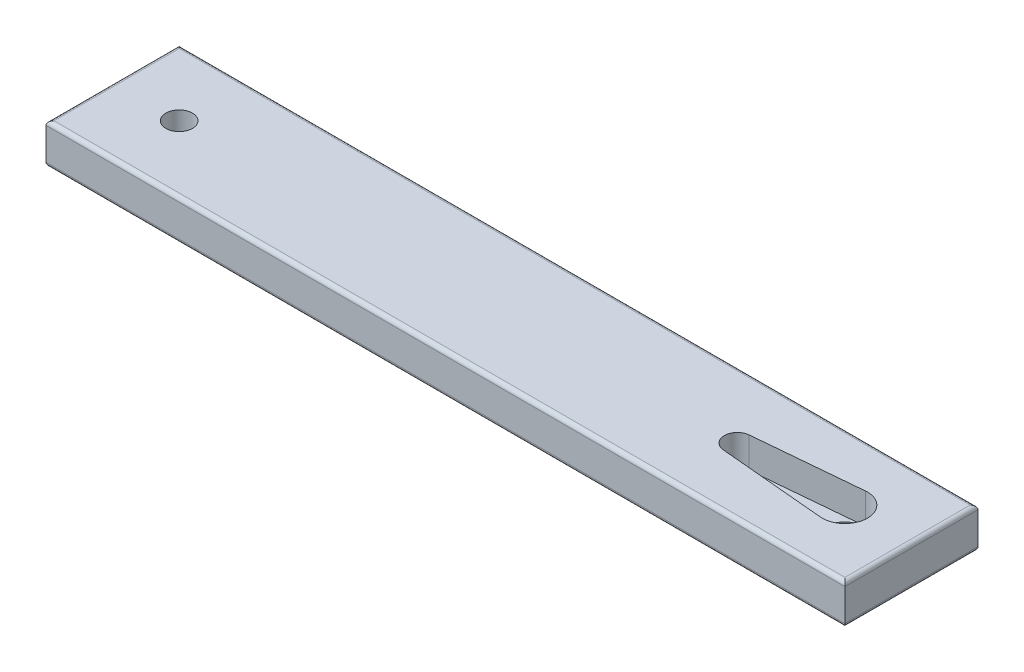
ISO-10303-21;
HEADER;
FILE_DESCRIPTION(('STEP AP214'),'2;1');
FILE_NAME('part.step','',(''),(''),'','','');
FILE_SCHEMA(('AUTOMOTIVE_DESIGN { 1 0 10303 214 1 1 1 1 }'));
ENDSEC;
DATA;
#1=APPLICATION_CONTEXT('core data for automotive mechanical design processes');
#2=APPLICATION_PROTOCOL_DEFINITION('international standard','automotive_design',2000,#1);
#3=PRODUCT_CONTEXT('',#1,'mechanical');
#4=PRODUCT('Part','Part','',(#3));
#5=PRODUCT_RELATED_PRODUCT_CATEGORY('part','',(#4));
#6=PRODUCT_DEFINITION_FORMATION('','',#4);
#7=PRODUCT_DEFINITION_CONTEXT('part definition',#1,'design');
#8=PRODUCT_DEFINITION('design','',#6,#7);
#9=PRODUCT_DEFINITION_SHAPE('','',#8);
#10=(LENGTH_UNIT() NAMED_UNIT(*) SI_UNIT(.MILLI.,.METRE.));
#11=(NAMED_UNIT(*) PLANE_ANGLE_UNIT() SI_UNIT($,.RADIAN.));
#12=(NAMED_UNIT(*) SI_UNIT($,.STERADIAN.) SOLID_ANGLE_UNIT());
#13=UNCERTAINTY_MEASURE_WITH_UNIT(LENGTH_MEASURE(1.E-05),#10,'distance_accuracy_value','');
#14=(GEOMETRIC_REPRESENTATION_CONTEXT(3) GLOBAL_UNCERTAINTY_ASSIGNED_CONTEXT((#13)) GLOBAL_UNIT_ASSIGNED_CONTEXT((#10,
#11,#12)) REPRESENTATION_CONTEXT('',''));
#15=CARTESIAN_POINT('',(0.,0.,0.));
#16=DIRECTION('',(0.,0.,1.));
#17=DIRECTION('',(1.,0.,0.));
#18=AXIS2_PLACEMENT_3D('',#15,#16,#17);
#19=CARTESIAN_POINT('',(0.,6.,0.));
#20=DIRECTION('',(1.,0.,0.));
#21=DIRECTION('',(0.,0.,-1.));
#22=AXIS2_PLACEMENT_3D('',#19,#20,#21);
#23=PLANE('',#22);
#24=DIRECTION('',(0.,-1.,0.));
#25=VECTOR('',#24,1.);
#26=CARTESIAN_POINT('',(0.,6.,-20.));
#27=LINE('',#26,#25);
#28=CARTESIAN_POINT('',(0.,5.4,-20.));
#29=VERTEX_POINT('',#28);
#30=CARTESIAN_POINT('',(0.,0.6,-20.));
#31=VERTEX_POINT('',#30);
#32=EDGE_CURVE('E189',#29,#31,#27,.T.);
#33=ORIENTED_EDGE('',*,*,#32,.T.);
#34=DIRECTION('',(0.,0.,1.));
#35=VECTOR('',#34,1.);
#36=CARTESIAN_POINT('',(0.,0.6,0.));
#37=LINE('',#36,#35);
#38=CARTESIAN_POINT('',(0.,0.6,0.));
#39=VERTEX_POINT('',#38);
#40=EDGE_CURVE('E233',#31,#39,#37,.T.);
#41=ORIENTED_EDGE('',*,*,#40,.T.);
#42=DIRECTION('',(0.,-1.,0.));
#43=VECTOR('',#42,1.);
#44=CARTESIAN_POINT('',(0.,6.,0.));
#45=LINE('',#44,#43);
#46=CARTESIAN_POINT('',(0.,5.4,0.));
#47=VERTEX_POINT('',#46);
#48=EDGE_CURVE('E201',#47,#39,#45,.T.);
#49=ORIENTED_EDGE('',*,*,#48,.F.);
#50=DIRECTION('',(0.,0.,1.));
#51=VECTOR('',#50,1.);
#52=CARTESIAN_POINT('',(0.,5.4,0.));
#53=LINE('',#52,#51);
#54=EDGE_CURVE('E228',#47,#29,#53,.F.);
#55=ORIENTED_EDGE('',*,*,#54,.T.);
#56=EDGE_LOOP('',(#33,#41,#49,#55));
#57=FACE_BOUND('',#56,.T.);
#58=ADVANCED_FACE('F44',(#57),#23,.F.);
#59=CARTESIAN_POINT('',(0.,6.,0.));
#60=DIRECTION('',(0.,0.,-1.));
#61=DIRECTION('',(-1.,0.,0.));
#62=AXIS2_PLACEMENT_3D('',#59,#60,#61);
#63=PLANE('',#62);
#64=ORIENTED_EDGE('',*,*,#48,.T.);
#65=DIRECTION('',(1.,0.,0.));
#66=VECTOR('',#65,1.);
#67=CARTESIAN_POINT('',(120.,0.6,0.));
#68=LINE('',#67,#66);
#69=CARTESIAN_POINT('',(120.,0.6,0.));
#70=VERTEX_POINT('',#69);
#71=EDGE_CURVE('E213',#39,#70,#68,.T.);
#72=ORIENTED_EDGE('',*,*,#71,.T.);
#73=DIRECTION('',(0.,-1.,0.));
#74=VECTOR('',#73,1.);
#75=CARTESIAN_POINT('',(120.,6.,0.));
#76=LINE('',#75,#74);
#77=CARTESIAN_POINT('',(120.,5.4,0.));
#78=VERTEX_POINT('',#77);
#79=EDGE_CURVE('E200',#78,#70,#76,.T.);
#80=ORIENTED_EDGE('',*,*,#79,.F.);
#81=DIRECTION('',(1.,0.,0.));
#82=VECTOR('',#81,1.);
#83=CARTESIAN_POINT('',(0.,5.4,0.));
#84=LINE('',#83,#82);
#85=EDGE_CURVE('E210',#78,#47,#84,.F.);
#86=ORIENTED_EDGE('',*,*,#85,.T.);
#87=EDGE_LOOP('',(#64,#72,#80,#86));
#88=FACE_BOUND('',#87,.T.);
#89=ADVANCED_FACE('F319',(#88),#63,.F.);
#90=CARTESIAN_POINT('',(120.,6.,0.));
#91=DIRECTION('',(-1.,0.,0.));
#92=DIRECTION('',(0.,0.,1.));
#93=AXIS2_PLACEMENT_3D('',#90,#91,#92);
#94=PLANE('',#93);
#95=ORIENTED_EDGE('',*,*,#79,.T.);
#96=DIRECTION('',(0.,0.,-1.));
#97=VECTOR('',#96,1.);
#98=CARTESIAN_POINT('',(120.,0.6,-20.));
#99=LINE('',#98,#97);
#100=CARTESIAN_POINT('',(120.,0.6,-20.));
#101=VERTEX_POINT('',#100);
#102=EDGE_CURVE('E247',#70,#101,#99,.T.);
#103=ORIENTED_EDGE('',*,*,#102,.T.);
#104=DIRECTION('',(0.,-1.,0.));
#105=VECTOR('',#104,1.);
#106=CARTESIAN_POINT('',(120.,6.,-20.));
#107=LINE('',#106,#105);
#108=CARTESIAN_POINT('',(120.,5.4,-20.));
#109=VERTEX_POINT('',#108);
#110=EDGE_CURVE('E191',#109,#101,#107,.T.);
#111=ORIENTED_EDGE('',*,*,#110,.F.);
#112=DIRECTION('',(0.,0.,-1.));
#113=VECTOR('',#112,1.);
#114=CARTESIAN_POINT('',(120.,5.4,0.));
#115=LINE('',#114,#113);
#116=EDGE_CURVE('E245',#109,#78,#115,.F.);
#117=ORIENTED_EDGE('',*,*,#116,.T.);
#118=EDGE_LOOP('',(#95,#103,#111,#117));
#119=FACE_BOUND('',#118,.T.);
#120=ADVANCED_FACE('F323',(#119),#94,.F.);
#121=CARTESIAN_POINT('',(0.,6.,-20.));
#122=DIRECTION('',(0.,0.,1.));
#123=DIRECTION('',(1.,0.,0.));
#124=AXIS2_PLACEMENT_3D('',#121,#122,#123);
#125=PLANE('',#124);
#126=ORIENTED_EDGE('',*,*,#110,.T.);
#127=DIRECTION('',(-1.,0.,0.));
#128=VECTOR('',#127,1.);
#129=CARTESIAN_POINT('',(0.,0.6,-20.));
#130=LINE('',#129,#128);
#131=EDGE_CURVE('E239',#101,#31,#130,.T.);
#132=ORIENTED_EDGE('',*,*,#131,.T.);
#133=ORIENTED_EDGE('',*,*,#32,.F.);
#134=DIRECTION('',(-1.,0.,0.));
#135=VECTOR('',#134,1.);
#136=CARTESIAN_POINT('',(0.,5.4,-20.));
#137=LINE('',#136,#135);
#138=EDGE_CURVE('E237',#29,#109,#137,.F.);
#139=ORIENTED_EDGE('',*,*,#138,.T.);
#140=EDGE_LOOP('',(#126,#132,#133,#139));
#141=FACE_BOUND('',#140,.T.);
#142=ADVANCED_FACE('F293',(#141),#125,.F.);
#143=CARTESIAN_POINT('',(0.,6.,0.));
#144=DIRECTION('',(0.,-1.,0.));
#145=DIRECTION('',(0.,0.,-1.));
#146=AXIS2_PLACEMENT_3D('',#143,#144,#145);
#147=PLANE('',#146);
#148=DIRECTION('',(1.,0.,0.));
#149=VECTOR('',#148,1.);
#150=CARTESIAN_POINT('',(0.,6.,-0.6));
#151=LINE('',#150,#149);
#152=CARTESIAN_POINT('',(0.6,6.,-0.6));
#153=VERTEX_POINT('',#152);
#154=CARTESIAN_POINT('',(119.4,6.,-0.6));
#155=VERTEX_POINT('',#154);
#156=EDGE_CURVE('E54',#153,#155,#151,.T.);
#157=ORIENTED_EDGE('',*,*,#156,.T.);
#158=DIRECTION('',(0.,0.,-1.));
#159=VECTOR('',#158,1.);
#160=CARTESIAN_POINT('',(119.4,6.,0.));
#161=LINE('',#160,#159);
#162=CARTESIAN_POINT('',(119.4,6.,-19.4));
#163=VERTEX_POINT('',#162);
#164=EDGE_CURVE('E11',#155,#163,#161,.T.);
#165=ORIENTED_EDGE('',*,*,#164,.T.);
#166=DIRECTION('',(-1.,0.,0.));
#167=VECTOR('',#166,1.);
#168=CARTESIAN_POINT('',(0.,6.,-19.4));
#169=LINE('',#168,#167);
#170=CARTESIAN_POINT('',(0.6,6.,-19.4));
#171=VERTEX_POINT('',#170);
#172=EDGE_CURVE('E249',#163,#171,#169,.T.);
#173=ORIENTED_EDGE('',*,*,#172,.T.);
#174=DIRECTION('',(0.,0.,1.));
#175=VECTOR('',#174,1.);
#176=CARTESIAN_POINT('',(0.6,6.,0.));
#177=LINE('',#176,#175);
#178=EDGE_CURVE('E67',#171,#153,#177,.T.);
#179=ORIENTED_EDGE('',*,*,#178,.T.);
#180=EDGE_LOOP('',(#157,#165,#173,#179));
#181=FACE_BOUND('',#180,.T.);
#182=CARTESIAN_POINT('',(10.,6.,-10.));
#183=DIRECTION('',(0.,1.,0.));
#184=DIRECTION('',(0.,0.,1.));
#185=AXIS2_PLACEMENT_3D('',#182,#183,#184);
#186=CIRCLE('',#185,2.);
#187=CARTESIAN_POINT('',(10.,6.,-8.));
#188=VERTEX_POINT('',#187);
#189=EDGE_CURVE('E269',#188,#188,#186,.T.);
#190=ORIENTED_EDGE('',*,*,#189,.F.);
#191=EDGE_LOOP('',(#190));
#192=FACE_BOUND('',#191,.T.);
#193=DIRECTION('',(0.995961325715572,0.,0.0897832817337462));
#194=VECTOR('',#193,1.);
#195=CARTESIAN_POINT('',(93.6749226006192,6.,-8.05787541485463));
#196=LINE('',#195,#194);
#197=CARTESIAN_POINT('',(93.6749226006192,6.,-8.05787541485463));
#198=VERTEX_POINT('',#197);
#199=CARTESIAN_POINT('',(109.694736842105,6.,-6.61373149256706));
#200=VERTEX_POINT('',#199);
#201=EDGE_CURVE('E178',#198,#200,#196,.T.);
#202=ORIENTED_EDGE('',*,*,#201,.F.);
#203=CARTESIAN_POINT('',(93.85,6.,-10.));
#204=DIRECTION('',(0.,1.,0.));
#205=DIRECTION('',(0.,0.,1.));
#206=AXIS2_PLACEMENT_3D('',#203,#204,#205);
#207=CIRCLE('',#206,1.95);
#208=CARTESIAN_POINT('',(93.6749226006192,6.,-11.9421245851454));
#209=VERTEX_POINT('',#208);
#210=EDGE_CURVE('E173',#209,#198,#207,.T.);
#211=ORIENTED_EDGE('',*,*,#210,.F.);
#212=DIRECTION('',(-0.995961325715572,0.,0.0897832817337459));
#213=VECTOR('',#212,1.);
#214=CARTESIAN_POINT('',(93.6749226006192,6.,-11.9421245851454));
#215=LINE('',#214,#213);
#216=CARTESIAN_POINT('',(109.694736842105,6.,-13.3862685074329));
#217=VERTEX_POINT('',#216);
#218=EDGE_CURVE('E184',#217,#209,#215,.T.);
#219=ORIENTED_EDGE('',*,*,#218,.F.);
#220=CARTESIAN_POINT('',(110.,6.,-10.));
#221=DIRECTION('',(0.,1.,0.));
#222=DIRECTION('',(0.,0.,1.));
#223=AXIS2_PLACEMENT_3D('',#220,#221,#222);
#224=CIRCLE('',#223,3.4);
#225=EDGE_CURVE('E152',#200,#217,#224,.T.);
#226=ORIENTED_EDGE('',*,*,#225,.F.);
#227=EDGE_LOOP('',(#202,#211,#219,#226));
#228=FACE_BOUND('',#227,.T.);
#229=ADVANCED_FACE('F329',(#181,#192,#228),#147,.F.);
#230=CARTESIAN_POINT('',(0.,0.,0.));
#231=DIRECTION('',(0.,-1.,0.));
#232=DIRECTION('',(0.,0.,-1.));
#233=AXIS2_PLACEMENT_3D('',#230,#231,#232);
#234=PLANE('',#233);
#235=DIRECTION('',(0.,0.,-1.));
#236=VECTOR('',#235,1.);
#237=CARTESIAN_POINT('',(119.4,0.,0.));
#238=LINE('',#237,#236);
#239=CARTESIAN_POINT('',(119.4,0.,-19.4));
#240=VERTEX_POINT('',#239);
#241=CARTESIAN_POINT('',(119.4,0.,-0.6));
#242=VERTEX_POINT('',#241);
#243=EDGE_CURVE('E220',#240,#242,#238,.F.);
#244=ORIENTED_EDGE('',*,*,#243,.T.);
#245=DIRECTION('',(1.,0.,0.));
#246=VECTOR('',#245,1.);
#247=CARTESIAN_POINT('',(0.,0.,-0.6));
#248=LINE('',#247,#246);
#249=CARTESIAN_POINT('',(0.6,0.,-0.6));
#250=VERTEX_POINT('',#249);
#251=EDGE_CURVE('E227',#242,#250,#248,.F.);
#252=ORIENTED_EDGE('',*,*,#251,.T.);
#253=DIRECTION('',(0.,0.,1.));
#254=VECTOR('',#253,1.);
#255=CARTESIAN_POINT('',(0.6,0.,-20.));
#256=LINE('',#255,#254);
#257=CARTESIAN_POINT('',(0.6,0.,-19.4));
#258=VERTEX_POINT('',#257);
#259=EDGE_CURVE('E224',#250,#258,#256,.F.);
#260=ORIENTED_EDGE('',*,*,#259,.T.);
#261=DIRECTION('',(-1.,0.,0.));
#262=VECTOR('',#261,1.);
#263=CARTESIAN_POINT('',(120.,0.,-19.4));
#264=LINE('',#263,#262);
#265=EDGE_CURVE('E219',#258,#240,#264,.F.);
#266=ORIENTED_EDGE('',*,*,#265,.T.);
#267=EDGE_LOOP('',(#244,#252,#260,#266));
#268=FACE_BOUND('',#267,.T.);
#269=CARTESIAN_POINT('',(10.,0.,-10.));
#270=DIRECTION('',(0.,1.,0.));
#271=DIRECTION('',(0.,0.,1.));
#272=AXIS2_PLACEMENT_3D('',#269,#270,#271);
#273=CIRCLE('',#272,2.);
#274=CARTESIAN_POINT('',(10.,0.,-8.));
#275=VERTEX_POINT('',#274);
#276=EDGE_CURVE('E150',#275,#275,#273,.T.);
#277=ORIENTED_EDGE('',*,*,#276,.T.);
#278=EDGE_LOOP('',(#277));
#279=FACE_BOUND('',#278,.T.);
#280=CARTESIAN_POINT('',(110.,0.,-10.));
#281=DIRECTION('',(0.,-1.,0.));
#282=DIRECTION('',(0.,0.,-1.));
#283=AXIS2_PLACEMENT_3D('',#280,#281,#282);
#284=CIRCLE('',#283,3.4);
#285=CARTESIAN_POINT('',(110.,0.,-13.4));
#286=VERTEX_POINT('',#285);
#287=EDGE_CURVE('E148',#286,#286,#284,.T.);
#288=ORIENTED_EDGE('',*,*,#287,.F.);
#289=EDGE_LOOP('',(#288));
#290=FACE_BOUND('',#289,.T.);
#291=ADVANCED_FACE('F309',(#268,#279,#290),#234,.T.);
#292=CARTESIAN_POINT('',(93.85,1.4,-10.));
#293=DIRECTION('',(0.,1.,0.));
#294=DIRECTION('',(0.,0.,1.));
#295=AXIS2_PLACEMENT_3D('',#292,#293,#294);
#296=CYLINDRICAL_SURFACE('',#295,1.95);
#297=ORIENTED_EDGE('',*,*,#210,.T.);
#298=DIRECTION('',(0.,1.,0.));
#299=VECTOR('',#298,1.);
#300=CARTESIAN_POINT('',(93.6749226006192,1.4,-8.05787541485463));
#301=LINE('',#300,#299);
#302=CARTESIAN_POINT('',(93.6749226006192,1.4,-8.05787541485463));
#303=VERTEX_POINT('',#302);
#304=EDGE_CURVE('E164',#303,#198,#301,.T.);
#305=ORIENTED_EDGE('',*,*,#304,.F.);
#306=CARTESIAN_POINT('',(93.85,1.4,-10.));
#307=DIRECTION('',(0.,1.,0.));
#308=DIRECTION('',(0.,0.,1.));
#309=AXIS2_PLACEMENT_3D('',#306,#307,#308);
#310=CIRCLE('',#309,1.95);
#311=CARTESIAN_POINT('',(93.6749226006192,1.4,-11.9421245851454));
#312=VERTEX_POINT('',#311);
#313=EDGE_CURVE('E172',#312,#303,#310,.T.);
#314=ORIENTED_EDGE('',*,*,#313,.F.);
#315=DIRECTION('',(0.,1.,0.));
#316=VECTOR('',#315,1.);
#317=CARTESIAN_POINT('',(93.6749226006192,1.4,-11.9421245851454));
#318=LINE('',#317,#316);
#319=EDGE_CURVE('E157',#312,#209,#318,.T.);
#320=ORIENTED_EDGE('',*,*,#319,.T.);
#321=EDGE_LOOP('',(#297,#305,#314,#320));
#322=FACE_BOUND('',#321,.T.);
#323=ADVANCED_FACE('F345',(#322),#296,.F.);
#324=CARTESIAN_POINT('',(93.6749226006192,1.4,-11.9421245851454));
#325=DIRECTION('',(-0.0897832817337459,0.,-0.995961325715572));
#326=DIRECTION('',(-0.995961325715572,0.,0.0897832817337459));
#327=AXIS2_PLACEMENT_3D('',#324,#325,#326);
#328=PLANE('',#327);
#329=ORIENTED_EDGE('',*,*,#218,.T.);
#330=ORIENTED_EDGE('',*,*,#319,.F.);
#331=DIRECTION('',(-0.995961325715572,0.,0.0897832817337459));
#332=VECTOR('',#331,1.);
#333=CARTESIAN_POINT('',(93.6749226006192,1.4,-11.9421245851454));
#334=LINE('',#333,#332);
#335=CARTESIAN_POINT('',(109.694736842105,1.4,-13.3862685074329));
#336=VERTEX_POINT('',#335);
#337=EDGE_CURVE('E136',#336,#312,#334,.T.);
#338=ORIENTED_EDGE('',*,*,#337,.F.);
#339=DIRECTION('',(0.,1.,0.));
#340=VECTOR('',#339,1.);
#341=CARTESIAN_POINT('',(109.694736842105,1.4,-13.3862685074329));
#342=LINE('',#341,#340);
#343=EDGE_CURVE('E147',#336,#217,#342,.T.);
#344=ORIENTED_EDGE('',*,*,#343,.T.);
#345=EDGE_LOOP('',(#329,#330,#338,#344));
#346=FACE_BOUND('',#345,.T.);
#347=ADVANCED_FACE('F165',(#346),#328,.F.);
#348=CARTESIAN_POINT('',(110.,1.4,-10.));
#349=DIRECTION('',(0.,1.,0.));
#350=DIRECTION('',(0.,0.,1.));
#351=AXIS2_PLACEMENT_3D('',#348,#349,#350);
#352=CYLINDRICAL_SURFACE('',#351,3.4);
#353=ORIENTED_EDGE('',*,*,#225,.T.);
#354=ORIENTED_EDGE('',*,*,#343,.F.);
#355=CARTESIAN_POINT('',(110.,1.4,-10.));
#356=DIRECTION('',(0.,1.,0.));
#357=DIRECTION('',(0.,0.,1.));
#358=AXIS2_PLACEMENT_3D('',#355,#356,#357);
#359=CIRCLE('',#358,3.4);
#360=CARTESIAN_POINT('',(109.694736842105,1.4,-6.61373149256706));
#361=VERTEX_POINT('',#360);
#362=EDGE_CURVE('E133',#336,#361,#359,.T.);
#363=ORIENTED_EDGE('',*,*,#362,.T.);
#364=DIRECTION('',(0.,1.,0.));
#365=VECTOR('',#364,1.);
#366=CARTESIAN_POINT('',(109.694736842105,1.4,-6.61373149256706));
#367=LINE('',#366,#365);
#368=EDGE_CURVE('E159',#361,#200,#367,.T.);
#369=ORIENTED_EDGE('',*,*,#368,.T.);
#370=EDGE_LOOP('',(#353,#354,#363,#369));
#371=FACE_BOUND('',#370,.T.);
#372=ORIENTED_EDGE('',*,*,#287,.T.);
#373=EDGE_LOOP('',(#372));
#374=FACE_BOUND('',#373,.T.);
#375=ADVANCED_FACE('F151',(#371,#374),#352,.F.);
#376=CARTESIAN_POINT('',(93.6749226006192,1.4,-8.05787541485463));
#377=DIRECTION('',(-0.0897832817337462,0.,0.995961325715572));
#378=DIRECTION('',(0.995961325715572,0.,0.0897832817337462));
#379=AXIS2_PLACEMENT_3D('',#376,#377,#378);
#380=PLANE('',#379);
#381=ORIENTED_EDGE('',*,*,#201,.T.);
#382=ORIENTED_EDGE('',*,*,#368,.F.);
#383=DIRECTION('',(0.995961325715572,0.,0.0897832817337462));
#384=VECTOR('',#383,1.);
#385=CARTESIAN_POINT('',(93.6749226006192,1.4,-8.05787541485463));
#386=LINE('',#385,#384);
#387=EDGE_CURVE('E142',#303,#361,#386,.T.);
#388=ORIENTED_EDGE('',*,*,#387,.F.);
#389=ORIENTED_EDGE('',*,*,#304,.T.);
#390=EDGE_LOOP('',(#381,#382,#388,#389));
#391=FACE_BOUND('',#390,.T.);
#392=ADVANCED_FACE('F338',(#391),#380,.F.);
#393=CARTESIAN_POINT('',(93.85,1.4,-10.));
#394=DIRECTION('',(0.,1.,0.));
#395=DIRECTION('',(0.,0.,1.));
#396=AXIS2_PLACEMENT_3D('',#393,#394,#395);
#397=PLANE('',#396);
#398=ORIENTED_EDGE('',*,*,#362,.F.);
#399=ORIENTED_EDGE('',*,*,#337,.T.);
#400=ORIENTED_EDGE('',*,*,#313,.T.);
#401=ORIENTED_EDGE('',*,*,#387,.T.);
#402=EDGE_LOOP('',(#398,#399,#400,#401));
#403=FACE_BOUND('',#402,.T.);
#404=ADVANCED_FACE('F140',(#403),#397,.T.);
#405=CARTESIAN_POINT('',(10.,0.,-10.));
#406=DIRECTION('',(0.,1.,0.));
#407=DIRECTION('',(0.,0.,1.));
#408=AXIS2_PLACEMENT_3D('',#405,#406,#407);
#409=CYLINDRICAL_SURFACE('',#408,2.);
#410=ORIENTED_EDGE('',*,*,#276,.F.);
#411=EDGE_LOOP('',(#410));
#412=FACE_BOUND('',#411,.T.);
#413=ORIENTED_EDGE('',*,*,#189,.T.);
#414=EDGE_LOOP('',(#413));
#415=FACE_BOUND('',#414,.T.);
#416=ADVANCED_FACE('F355',(#412,#415),#409,.F.);
#417=CARTESIAN_POINT('',(0.,0.6,-19.4));
#418=DIRECTION('',(1.,0.,0.));
#419=DIRECTION('',(0.,0.,-1.));
#420=AXIS2_PLACEMENT_3D('',#417,#418,#419);
#421=CYLINDRICAL_SURFACE('',#420,0.6);
#422=CARTESIAN_POINT('',(119.4,0.6,-19.4));
#423=DIRECTION('',(0.707106781186547,0.,0.707106781186547));
#424=DIRECTION('',(-0.707106781186547,0.,0.707106781186547));
#425=AXIS2_PLACEMENT_3D('',#422,#423,#424);
#426=ELLIPSE('',#425,0.848528137423857,0.6);
#427=EDGE_CURVE('E265',#240,#101,#426,.T.);
#428=ORIENTED_EDGE('',*,*,#427,.F.);
#429=ORIENTED_EDGE('',*,*,#265,.F.);
#430=CARTESIAN_POINT('',(0.6,0.6,-19.4));
#431=DIRECTION('',(0.707106781186547,0.,-0.707106781186547));
#432=DIRECTION('',(0.707106781186547,0.,0.707106781186547));
#433=AXIS2_PLACEMENT_3D('',#430,#431,#432);
#434=ELLIPSE('',#433,0.848528137423857,0.6);
#435=EDGE_CURVE('E266',#31,#258,#434,.F.);
#436=ORIENTED_EDGE('',*,*,#435,.F.);
#437=ORIENTED_EDGE('',*,*,#131,.F.);
#438=EDGE_LOOP('',(#428,#429,#436,#437));
#439=FACE_BOUND('',#438,.T.);
#440=ADVANCED_FACE('F298',(#439),#421,.T.);
#441=CARTESIAN_POINT('',(0.6,0.6,0.));
#442=DIRECTION('',(0.,0.,-1.));
#443=DIRECTION('',(-1.,0.,0.));
#444=AXIS2_PLACEMENT_3D('',#441,#442,#443);
#445=CYLINDRICAL_SURFACE('',#444,0.6);
#446=ORIENTED_EDGE('',*,*,#435,.T.);
#447=ORIENTED_EDGE('',*,*,#259,.F.);
#448=CARTESIAN_POINT('',(0.6,0.6,-0.6));
#449=DIRECTION('',(-0.707106781186547,0.,-0.707106781186547));
#450=DIRECTION('',(0.707106781186547,0.,-0.707106781186547));
#451=AXIS2_PLACEMENT_3D('',#448,#449,#450);
#452=ELLIPSE('',#451,0.848528137423857,0.6);
#453=EDGE_CURVE('E259',#39,#250,#452,.F.);
#454=ORIENTED_EDGE('',*,*,#453,.F.);
#455=ORIENTED_EDGE('',*,*,#40,.F.);
#456=EDGE_LOOP('',(#446,#447,#454,#455));
#457=FACE_BOUND('',#456,.T.);
#458=ADVANCED_FACE('F318',(#457),#445,.T.);
#459=CARTESIAN_POINT('',(119.4,0.6,0.));
#460=DIRECTION('',(0.,0.,1.));
#461=DIRECTION('',(1.,0.,0.));
#462=AXIS2_PLACEMENT_3D('',#459,#460,#461);
#463=CYLINDRICAL_SURFACE('',#462,0.6);
#464=ORIENTED_EDGE('',*,*,#427,.T.);
#465=ORIENTED_EDGE('',*,*,#102,.F.);
#466=CARTESIAN_POINT('',(119.4,0.6,-0.6));
#467=DIRECTION('',(-0.707106781186547,0.,0.707106781186547));
#468=DIRECTION('',(0.707106781186547,0.,0.707106781186547));
#469=AXIS2_PLACEMENT_3D('',#466,#467,#468);
#470=ELLIPSE('',#469,0.848528137423857,0.6);
#471=EDGE_CURVE('E258',#242,#70,#470,.T.);
#472=ORIENTED_EDGE('',*,*,#471,.F.);
#473=ORIENTED_EDGE('',*,*,#243,.F.);
#474=EDGE_LOOP('',(#464,#465,#472,#473));
#475=FACE_BOUND('',#474,.T.);
#476=ADVANCED_FACE('F308',(#475),#463,.T.);
#477=CARTESIAN_POINT('',(0.,0.6,-0.6));
#478=DIRECTION('',(-1.,0.,0.));
#479=DIRECTION('',(0.,0.,1.));
#480=AXIS2_PLACEMENT_3D('',#477,#478,#479);
#481=CYLINDRICAL_SURFACE('',#480,0.6);
#482=ORIENTED_EDGE('',*,*,#453,.T.);
#483=ORIENTED_EDGE('',*,*,#251,.F.);
#484=ORIENTED_EDGE('',*,*,#471,.T.);
#485=ORIENTED_EDGE('',*,*,#71,.F.);
#486=EDGE_LOOP('',(#482,#483,#484,#485));
#487=FACE_BOUND('',#486,.T.);
#488=ADVANCED_FACE('F311',(#487),#481,.T.);
#489=CARTESIAN_POINT('',(0.6,5.4,0.));
#490=DIRECTION('',(0.,0.,1.));
#491=DIRECTION('',(1.,0.,0.));
#492=AXIS2_PLACEMENT_3D('',#489,#490,#491);
#493=CYLINDRICAL_SURFACE('',#492,0.6);
#494=CARTESIAN_POINT('',(0.6,5.4,-19.4));
#495=DIRECTION('',(-0.707106781186547,0.,0.707106781186547));
#496=DIRECTION('',(-0.707106781186547,0.,-0.707106781186547));
#497=AXIS2_PLACEMENT_3D('',#494,#495,#496);
#498=ELLIPSE('',#497,0.848528137423857,0.6);
#499=EDGE_CURVE('E277',#29,#171,#498,.F.);
#500=ORIENTED_EDGE('',*,*,#499,.F.);
#501=ORIENTED_EDGE('',*,*,#54,.F.);
#502=CARTESIAN_POINT('',(0.6,5.4,-0.6));
#503=DIRECTION('',(0.707106781186547,0.,0.707106781186547));
#504=DIRECTION('',(-0.707106781186547,0.,0.707106781186547));
#505=AXIS2_PLACEMENT_3D('',#502,#503,#504);
#506=ELLIPSE('',#505,0.848528137423857,0.6);
#507=EDGE_CURVE('E47',#153,#47,#506,.T.);
#508=ORIENTED_EDGE('',*,*,#507,.F.);
#509=ORIENTED_EDGE('',*,*,#178,.F.);
#510=EDGE_LOOP('',(#500,#501,#508,#509));
#511=FACE_BOUND('',#510,.T.);
#512=ADVANCED_FACE('F50',(#511),#493,.T.);
#513=CARTESIAN_POINT('',(0.,5.4,-0.6));
#514=DIRECTION('',(1.,0.,0.));
#515=DIRECTION('',(0.,0.,-1.));
#516=AXIS2_PLACEMENT_3D('',#513,#514,#515);
#517=CYLINDRICAL_SURFACE('',#516,0.6);
#518=ORIENTED_EDGE('',*,*,#507,.T.);
#519=ORIENTED_EDGE('',*,*,#85,.F.);
#520=CARTESIAN_POINT('',(119.4,5.4,-0.6));
#521=DIRECTION('',(0.707106781186547,0.,-0.707106781186547));
#522=DIRECTION('',(0.707106781186547,0.,0.707106781186547));
#523=AXIS2_PLACEMENT_3D('',#520,#521,#522);
#524=ELLIPSE('',#523,0.848528137423857,0.6);
#525=EDGE_CURVE('E273',#155,#78,#524,.T.);
#526=ORIENTED_EDGE('',*,*,#525,.F.);
#527=ORIENTED_EDGE('',*,*,#156,.F.);
#528=EDGE_LOOP('',(#518,#519,#526,#527));
#529=FACE_BOUND('',#528,.T.);
#530=ADVANCED_FACE('F290',(#529),#517,.T.);
#531=CARTESIAN_POINT('',(0.,5.4,-19.4));
#532=DIRECTION('',(-1.,0.,0.));
#533=DIRECTION('',(0.,0.,1.));
#534=AXIS2_PLACEMENT_3D('',#531,#532,#533);
#535=CYLINDRICAL_SURFACE('',#534,0.6);
#536=ORIENTED_EDGE('',*,*,#499,.T.);
#537=ORIENTED_EDGE('',*,*,#172,.F.);
#538=CARTESIAN_POINT('',(119.4,5.4,-19.4));
#539=DIRECTION('',(-0.707106781186547,0.,-0.707106781186547));
#540=DIRECTION('',(-0.707106781186547,0.,0.707106781186547));
#541=AXIS2_PLACEMENT_3D('',#538,#539,#540);
#542=ELLIPSE('',#541,0.848528137423857,0.6);
#543=EDGE_CURVE('E271',#109,#163,#542,.F.);
#544=ORIENTED_EDGE('',*,*,#543,.F.);
#545=ORIENTED_EDGE('',*,*,#138,.F.);
#546=EDGE_LOOP('',(#536,#537,#544,#545));
#547=FACE_BOUND('',#546,.T.);
#548=ADVANCED_FACE('F328',(#547),#535,.T.);
#549=CARTESIAN_POINT('',(119.4,5.4,0.));
#550=DIRECTION('',(0.,0.,-1.));
#551=DIRECTION('',(-1.,0.,0.));
#552=AXIS2_PLACEMENT_3D('',#549,#550,#551);
#553=CYLINDRICAL_SURFACE('',#552,0.6);
#554=ORIENTED_EDGE('',*,*,#525,.T.);
#555=ORIENTED_EDGE('',*,*,#116,.F.);
#556=ORIENTED_EDGE('',*,*,#543,.T.);
#557=ORIENTED_EDGE('',*,*,#164,.F.);
#558=EDGE_LOOP('',(#554,#555,#556,#557));
#559=FACE_BOUND('',#558,.T.);
#560=ADVANCED_FACE('F330',(#559),#553,.T.);
#561=CLOSED_SHELL('',(#58,#89,#120,#142,#229,#291,#323,#347,#375,#392,#404,#416,#440,#458,#476,
#488,#512,#530,#548,#560));
#562=MANIFOLD_SOLID_BREP('B2',#561);
#563=ADVANCED_BREP_SHAPE_REPRESENTATION('',(#18,#562),#14);
#564=SHAPE_DEFINITION_REPRESENTATION(#9,#563);
ENDSEC;
END-ISO-10303-21;
